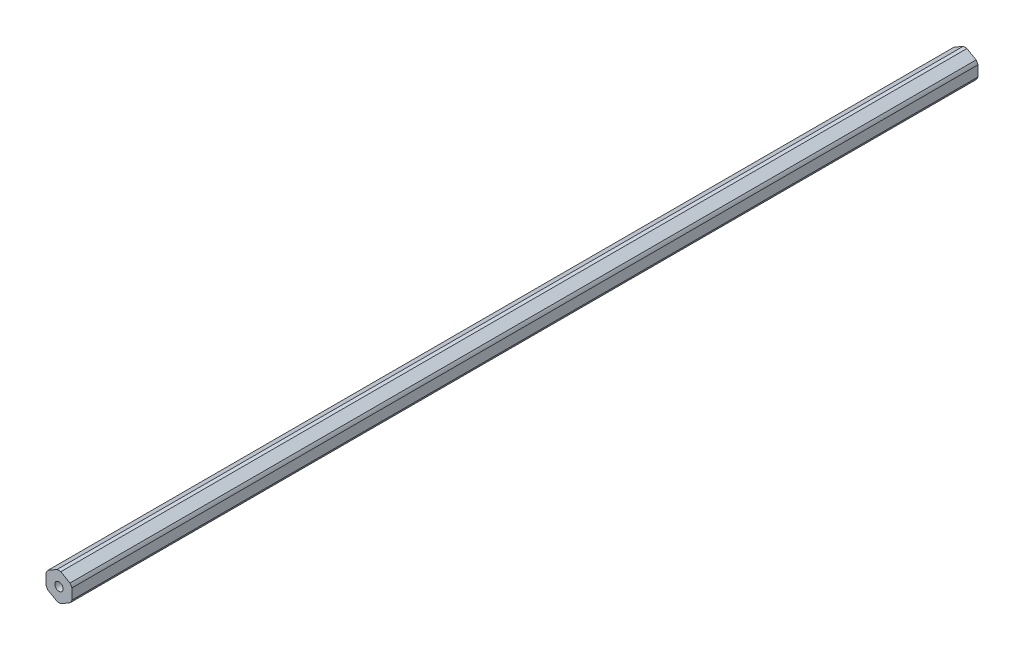
ISO-10303-21;
HEADER;
FILE_DESCRIPTION(('STEP AP214'),'2;1');
FILE_NAME('part.step','',(''),(''),'','','');
FILE_SCHEMA(('AUTOMOTIVE_DESIGN { 1 0 10303 214 1 1 1 1 }'));
ENDSEC;
DATA;
#1=APPLICATION_CONTEXT('core data for automotive mechanical design processes');
#2=APPLICATION_PROTOCOL_DEFINITION('international standard','automotive_design',2000,#1);
#3=PRODUCT_CONTEXT('',#1,'mechanical');
#4=PRODUCT('Part','Part','',(#3));
#5=PRODUCT_RELATED_PRODUCT_CATEGORY('part','',(#4));
#6=PRODUCT_DEFINITION_FORMATION('','',#4);
#7=PRODUCT_DEFINITION_CONTEXT('part definition',#1,'design');
#8=PRODUCT_DEFINITION('design','',#6,#7);
#9=PRODUCT_DEFINITION_SHAPE('','',#8);
#10=(LENGTH_UNIT() NAMED_UNIT(*) SI_UNIT(.MILLI.,.METRE.));
#11=(NAMED_UNIT(*) PLANE_ANGLE_UNIT() SI_UNIT($,.RADIAN.));
#12=(NAMED_UNIT(*) SI_UNIT($,.STERADIAN.) SOLID_ANGLE_UNIT());
#13=UNCERTAINTY_MEASURE_WITH_UNIT(LENGTH_MEASURE(1.E-05),#10,'distance_accuracy_value','');
#14=(GEOMETRIC_REPRESENTATION_CONTEXT(3) GLOBAL_UNCERTAINTY_ASSIGNED_CONTEXT((#13)) GLOBAL_UNIT_ASSIGNED_CONTEXT((#10,
#11,#12)) REPRESENTATION_CONTEXT('',''));
#15=CARTESIAN_POINT('',(0.,0.,0.));
#16=DIRECTION('',(0.,0.,1.));
#17=DIRECTION('',(1.,0.,0.));
#18=AXIS2_PLACEMENT_3D('',#15,#16,#17);
#19=CARTESIAN_POINT('',(6.35,0.,444.5));
#20=DIRECTION('',(-1.,0.,0.));
#21=DIRECTION('',(0.,-1.,0.));
#22=AXIS2_PLACEMENT_3D('',#19,#20,#21);
#23=PLANE('',#22);
#24=DIRECTION('',(0.,1.,0.));
#25=VECTOR('',#24,1.);
#26=CARTESIAN_POINT('',(6.35,0.,0.));
#27=LINE('',#26,#25);
#28=CARTESIAN_POINT('',(6.35,-2.59030191290514,0.));
#29=VERTEX_POINT('',#28);
#30=CARTESIAN_POINT('',(6.35,2.59030191290514,0.));
#31=VERTEX_POINT('',#30);
#32=EDGE_CURVE('E180',#29,#31,#27,.T.);
#33=ORIENTED_EDGE('',*,*,#32,.T.);
#34=DIRECTION('',(0.,0.,-1.));
#35=VECTOR('',#34,1.);
#36=CARTESIAN_POINT('',(6.35,2.59030191290514,444.5));
#37=LINE('',#36,#35);
#38=CARTESIAN_POINT('',(6.35,2.59030191290514,444.5));
#39=VERTEX_POINT('',#38);
#40=EDGE_CURVE('E11',#39,#31,#37,.T.);
#41=ORIENTED_EDGE('',*,*,#40,.F.);
#42=DIRECTION('',(0.,1.,0.));
#43=VECTOR('',#42,1.);
#44=CARTESIAN_POINT('',(6.35,0.,444.5));
#45=LINE('',#44,#43);
#46=CARTESIAN_POINT('',(6.35,-2.59030191290514,444.5));
#47=VERTEX_POINT('',#46);
#48=EDGE_CURVE('E260',#47,#39,#45,.T.);
#49=ORIENTED_EDGE('',*,*,#48,.F.);
#50=DIRECTION('',(0.,0.,-1.));
#51=VECTOR('',#50,1.);
#52=CARTESIAN_POINT('',(6.35,-2.59030191290514,444.5));
#53=LINE('',#52,#51);
#54=EDGE_CURVE('E176',#47,#29,#53,.T.);
#55=ORIENTED_EDGE('',*,*,#54,.T.);
#56=EDGE_LOOP('',(#33,#41,#49,#55));
#57=FACE_BOUND('',#56,.T.);
#58=ADVANCED_FACE('F51',(#57),#23,.F.);
#59=CARTESIAN_POINT('',(0.,0.,444.5));
#60=DIRECTION('',(0.,0.,-1.));
#61=DIRECTION('',(-1.,0.,0.));
#62=AXIS2_PLACEMENT_3D('',#59,#60,#61);
#63=CYLINDRICAL_SURFACE('',#62,6.858);
#64=CARTESIAN_POINT('',(0.,0.,0.));
#65=DIRECTION('',(0.,0.,1.));
#66=DIRECTION('',(1.,0.,0.));
#67=AXIS2_PLACEMENT_3D('',#64,#65,#66);
#68=CIRCLE('',#67,6.858);
#69=CARTESIAN_POINT('',(5.41826726004728,4.20411035757861,0.));
#70=VERTEX_POINT('',#69);
#71=EDGE_CURVE('E184',#31,#70,#68,.T.);
#72=ORIENTED_EDGE('',*,*,#71,.T.);
#73=DIRECTION('',(0.,0.,-1.));
#74=VECTOR('',#73,1.);
#75=CARTESIAN_POINT('',(5.41826726004728,4.20411035757861,444.5));
#76=LINE('',#75,#74);
#77=CARTESIAN_POINT('',(5.41826726004728,4.20411035757861,444.5));
#78=VERTEX_POINT('',#77);
#79=EDGE_CURVE('E60',#78,#70,#76,.T.);
#80=ORIENTED_EDGE('',*,*,#79,.F.);
#81=CARTESIAN_POINT('',(0.,0.,444.5));
#82=DIRECTION('',(0.,0.,1.));
#83=DIRECTION('',(1.,0.,0.));
#84=AXIS2_PLACEMENT_3D('',#81,#82,#83);
#85=CIRCLE('',#84,6.858);
#86=EDGE_CURVE('E124',#39,#78,#85,.T.);
#87=ORIENTED_EDGE('',*,*,#86,.F.);
#88=ORIENTED_EDGE('',*,*,#40,.T.);
#89=EDGE_LOOP('',(#72,#80,#87,#88));
#90=FACE_BOUND('',#89,.T.);
#91=ADVANCED_FACE('F303',(#90),#63,.T.);
#92=CARTESIAN_POINT('',(3.175,5.49926131403118,444.5));
#93=DIRECTION('',(-0.5,-0.866025403784439,0.));
#94=DIRECTION('',(0.866025403784439,-0.5,0.));
#95=AXIS2_PLACEMENT_3D('',#92,#93,#94);
#96=PLANE('',#95);
#97=DIRECTION('',(-0.866025403784439,0.5,0.));
#98=VECTOR('',#97,1.);
#99=CARTESIAN_POINT('',(3.175,5.49926131403118,0.));
#100=LINE('',#99,#98);
#101=CARTESIAN_POINT('',(0.93173273995272,6.79441227048376,0.));
#102=VERTEX_POINT('',#101);
#103=EDGE_CURVE('E188',#70,#102,#100,.T.);
#104=ORIENTED_EDGE('',*,*,#103,.T.);
#105=DIRECTION('',(0.,0.,-1.));
#106=VECTOR('',#105,1.);
#107=CARTESIAN_POINT('',(0.93173273995272,6.79441227048376,444.5));
#108=LINE('',#107,#106);
#109=CARTESIAN_POINT('',(0.93173273995272,6.79441227048376,444.5));
#110=VERTEX_POINT('',#109);
#111=EDGE_CURVE('E231',#110,#102,#108,.T.);
#112=ORIENTED_EDGE('',*,*,#111,.F.);
#113=DIRECTION('',(-0.866025403784439,0.5,0.));
#114=VECTOR('',#113,1.);
#115=CARTESIAN_POINT('',(3.175,5.49926131403118,444.5));
#116=LINE('',#115,#114);
#117=EDGE_CURVE('E241',#78,#110,#116,.T.);
#118=ORIENTED_EDGE('',*,*,#117,.F.);
#119=ORIENTED_EDGE('',*,*,#79,.T.);
#120=EDGE_LOOP('',(#104,#112,#118,#119));
#121=FACE_BOUND('',#120,.T.);
#122=ADVANCED_FACE('F239',(#121),#96,.F.);
#123=CARTESIAN_POINT('',(-0.931732739952724,6.79441227048375,0.));
#124=VERTEX_POINT('',#123);
#125=EDGE_CURVE('E189',#102,#124,#68,.T.);
#126=ORIENTED_EDGE('',*,*,#125,.T.);
#127=DIRECTION('',(0.,0.,-1.));
#128=VECTOR('',#127,1.);
#129=CARTESIAN_POINT('',(-0.931732739952724,6.79441227048375,444.5));
#130=LINE('',#129,#128);
#131=CARTESIAN_POINT('',(-0.931732739952724,6.79441227048375,444.5));
#132=VERTEX_POINT('',#131);
#133=EDGE_CURVE('E227',#132,#124,#130,.T.);
#134=ORIENTED_EDGE('',*,*,#133,.F.);
#135=EDGE_CURVE('E266',#110,#132,#85,.T.);
#136=ORIENTED_EDGE('',*,*,#135,.F.);
#137=ORIENTED_EDGE('',*,*,#111,.T.);
#138=EDGE_LOOP('',(#126,#134,#136,#137));
#139=FACE_BOUND('',#138,.T.);
#140=ADVANCED_FACE('F286',(#139),#63,.T.);
#141=CARTESIAN_POINT('',(-3.175,5.49926131403118,444.5));
#142=DIRECTION('',(0.5,-0.866025403784438,0.));
#143=DIRECTION('',(0.866025403784438,0.500000000000001,0.));
#144=AXIS2_PLACEMENT_3D('',#141,#142,#143);
#145=PLANE('',#144);
#146=DIRECTION('',(-0.866025403784438,-0.500000000000001,0.));
#147=VECTOR('',#146,1.);
#148=CARTESIAN_POINT('',(-3.175,5.49926131403118,0.));
#149=LINE('',#148,#147);
#150=CARTESIAN_POINT('',(-5.41826726004728,4.20411035757861,0.));
#151=VERTEX_POINT('',#150);
#152=EDGE_CURVE('E192',#124,#151,#149,.T.);
#153=ORIENTED_EDGE('',*,*,#152,.T.);
#154=DIRECTION('',(0.,0.,-1.));
#155=VECTOR('',#154,1.);
#156=CARTESIAN_POINT('',(-5.41826726004728,4.20411035757861,444.5));
#157=LINE('',#156,#155);
#158=CARTESIAN_POINT('',(-5.41826726004728,4.20411035757861,444.5));
#159=VERTEX_POINT('',#158);
#160=EDGE_CURVE('E223',#159,#151,#157,.T.);
#161=ORIENTED_EDGE('',*,*,#160,.F.);
#162=DIRECTION('',(-0.866025403784438,-0.500000000000001,0.));
#163=VECTOR('',#162,1.);
#164=CARTESIAN_POINT('',(-3.175,5.49926131403118,444.5));
#165=LINE('',#164,#163);
#166=EDGE_CURVE('E272',#132,#159,#165,.T.);
#167=ORIENTED_EDGE('',*,*,#166,.F.);
#168=ORIENTED_EDGE('',*,*,#133,.T.);
#169=EDGE_LOOP('',(#153,#161,#167,#168));
#170=FACE_BOUND('',#169,.T.);
#171=ADVANCED_FACE('F288',(#170),#145,.F.);
#172=CARTESIAN_POINT('',(-6.35,2.59030191290514,0.));
#173=VERTEX_POINT('',#172);
#174=EDGE_CURVE('E195',#151,#173,#68,.T.);
#175=ORIENTED_EDGE('',*,*,#174,.T.);
#176=DIRECTION('',(0.,0.,-1.));
#177=VECTOR('',#176,1.);
#178=CARTESIAN_POINT('',(-6.35,2.59030191290514,444.5));
#179=LINE('',#178,#177);
#180=CARTESIAN_POINT('',(-6.35,2.59030191290514,444.5));
#181=VERTEX_POINT('',#180);
#182=EDGE_CURVE('E219',#181,#173,#179,.T.);
#183=ORIENTED_EDGE('',*,*,#182,.F.);
#184=EDGE_CURVE('E274',#159,#181,#85,.T.);
#185=ORIENTED_EDGE('',*,*,#184,.F.);
#186=ORIENTED_EDGE('',*,*,#160,.T.);
#187=EDGE_LOOP('',(#175,#183,#185,#186));
#188=FACE_BOUND('',#187,.T.);
#189=ADVANCED_FACE('F289',(#188),#63,.T.);
#190=CARTESIAN_POINT('',(-6.35,0.,444.5));
#191=DIRECTION('',(1.,0.,0.));
#192=DIRECTION('',(0.,1.,0.));
#193=AXIS2_PLACEMENT_3D('',#190,#191,#192);
#194=PLANE('',#193);
#195=DIRECTION('',(0.,-1.,0.));
#196=VECTOR('',#195,1.);
#197=CARTESIAN_POINT('',(-6.35,0.,0.));
#198=LINE('',#197,#196);
#199=CARTESIAN_POINT('',(-6.35,-2.59030191290515,0.));
#200=VERTEX_POINT('',#199);
#201=EDGE_CURVE('E196',#173,#200,#198,.T.);
#202=ORIENTED_EDGE('',*,*,#201,.T.);
#203=DIRECTION('',(0.,0.,-1.));
#204=VECTOR('',#203,1.);
#205=CARTESIAN_POINT('',(-6.35,-2.59030191290515,444.5));
#206=LINE('',#205,#204);
#207=CARTESIAN_POINT('',(-6.35,-2.59030191290515,444.5));
#208=VERTEX_POINT('',#207);
#209=EDGE_CURVE('E215',#208,#200,#206,.T.);
#210=ORIENTED_EDGE('',*,*,#209,.F.);
#211=DIRECTION('',(0.,-1.,0.));
#212=VECTOR('',#211,1.);
#213=CARTESIAN_POINT('',(-6.35,0.,444.5));
#214=LINE('',#213,#212);
#215=EDGE_CURVE('E275',#181,#208,#214,.T.);
#216=ORIENTED_EDGE('',*,*,#215,.F.);
#217=ORIENTED_EDGE('',*,*,#182,.T.);
#218=EDGE_LOOP('',(#202,#210,#216,#217));
#219=FACE_BOUND('',#218,.T.);
#220=ADVANCED_FACE('F292',(#219),#194,.F.);
#221=CARTESIAN_POINT('',(-5.41826726004727,-4.20411035757862,0.));
#222=VERTEX_POINT('',#221);
#223=EDGE_CURVE('E199',#200,#222,#68,.T.);
#224=ORIENTED_EDGE('',*,*,#223,.T.);
#225=DIRECTION('',(0.,0.,-1.));
#226=VECTOR('',#225,1.);
#227=CARTESIAN_POINT('',(-5.41826726004727,-4.20411035757862,444.5));
#228=LINE('',#227,#226);
#229=CARTESIAN_POINT('',(-5.41826726004727,-4.20411035757862,444.5));
#230=VERTEX_POINT('',#229);
#231=EDGE_CURVE('E211',#230,#222,#228,.T.);
#232=ORIENTED_EDGE('',*,*,#231,.F.);
#233=EDGE_CURVE('E163',#208,#230,#85,.T.);
#234=ORIENTED_EDGE('',*,*,#233,.F.);
#235=ORIENTED_EDGE('',*,*,#209,.T.);
#236=EDGE_LOOP('',(#224,#232,#234,#235));
#237=FACE_BOUND('',#236,.T.);
#238=ADVANCED_FACE('F294',(#237),#63,.T.);
#239=CARTESIAN_POINT('',(-3.175,-5.49926131403119,444.5));
#240=DIRECTION('',(0.5,0.866025403784439,0.));
#241=DIRECTION('',(-0.866025403784439,0.5,0.));
#242=AXIS2_PLACEMENT_3D('',#239,#240,#241);
#243=PLANE('',#242);
#244=DIRECTION('',(0.866025403784439,-0.5,0.));
#245=VECTOR('',#244,1.);
#246=CARTESIAN_POINT('',(-3.175,-5.49926131403119,0.));
#247=LINE('',#246,#245);
#248=CARTESIAN_POINT('',(-0.931732739952729,-6.79441227048375,0.));
#249=VERTEX_POINT('',#248);
#250=EDGE_CURVE('E200',#222,#249,#247,.T.);
#251=ORIENTED_EDGE('',*,*,#250,.T.);
#252=DIRECTION('',(0.,0.,-1.));
#253=VECTOR('',#252,1.);
#254=CARTESIAN_POINT('',(-0.931732739952729,-6.79441227048375,444.5));
#255=LINE('',#254,#253);
#256=CARTESIAN_POINT('',(-0.931732739952729,-6.79441227048375,444.5));
#257=VERTEX_POINT('',#256);
#258=EDGE_CURVE('E169',#257,#249,#255,.T.);
#259=ORIENTED_EDGE('',*,*,#258,.F.);
#260=DIRECTION('',(0.866025403784439,-0.5,0.));
#261=VECTOR('',#260,1.);
#262=CARTESIAN_POINT('',(-3.175,-5.49926131403119,444.5));
#263=LINE('',#262,#261);
#264=EDGE_CURVE('E157',#230,#257,#263,.T.);
#265=ORIENTED_EDGE('',*,*,#264,.F.);
#266=ORIENTED_EDGE('',*,*,#231,.T.);
#267=EDGE_LOOP('',(#251,#259,#265,#266));
#268=FACE_BOUND('',#267,.T.);
#269=ADVANCED_FACE('F297',(#268),#243,.F.);
#270=CARTESIAN_POINT('',(0.931732739952726,-6.79441227048375,0.));
#271=VERTEX_POINT('',#270);
#272=EDGE_CURVE('E167',#249,#271,#68,.T.);
#273=ORIENTED_EDGE('',*,*,#272,.T.);
#274=DIRECTION('',(0.,0.,-1.));
#275=VECTOR('',#274,1.);
#276=CARTESIAN_POINT('',(0.931732739952726,-6.79441227048375,444.5));
#277=LINE('',#276,#275);
#278=CARTESIAN_POINT('',(0.931732739952726,-6.79441227048375,444.5));
#279=VERTEX_POINT('',#278);
#280=EDGE_CURVE('E164',#279,#271,#277,.T.);
#281=ORIENTED_EDGE('',*,*,#280,.F.);
#282=EDGE_CURVE('E151',#257,#279,#85,.T.);
#283=ORIENTED_EDGE('',*,*,#282,.F.);
#284=ORIENTED_EDGE('',*,*,#258,.T.);
#285=EDGE_LOOP('',(#273,#281,#283,#284));
#286=FACE_BOUND('',#285,.T.);
#287=ADVANCED_FACE('F165',(#286),#63,.T.);
#288=CARTESIAN_POINT('',(3.175,-5.49926131403118,444.5));
#289=DIRECTION('',(-0.5,0.866025403784439,0.));
#290=DIRECTION('',(-0.866025403784439,-0.5,0.));
#291=AXIS2_PLACEMENT_3D('',#288,#289,#290);
#292=PLANE('',#291);
#293=DIRECTION('',(0.866025403784439,0.5,0.));
#294=VECTOR('',#293,1.);
#295=CARTESIAN_POINT('',(3.175,-5.49926131403118,0.));
#296=LINE('',#295,#294);
#297=CARTESIAN_POINT('',(5.41826726004728,-4.20411035757862,0.));
#298=VERTEX_POINT('',#297);
#299=EDGE_CURVE('E110',#271,#298,#296,.T.);
#300=ORIENTED_EDGE('',*,*,#299,.T.);
#301=DIRECTION('',(0.,0.,-1.));
#302=VECTOR('',#301,1.);
#303=CARTESIAN_POINT('',(5.41826726004728,-4.20411035757862,444.5));
#304=LINE('',#303,#302);
#305=CARTESIAN_POINT('',(5.41826726004728,-4.20411035757862,444.5));
#306=VERTEX_POINT('',#305);
#307=EDGE_CURVE('E170',#306,#298,#304,.T.);
#308=ORIENTED_EDGE('',*,*,#307,.F.);
#309=DIRECTION('',(0.866025403784439,0.5,0.));
#310=VECTOR('',#309,1.);
#311=CARTESIAN_POINT('',(3.175,-5.49926131403118,444.5));
#312=LINE('',#311,#310);
#313=EDGE_CURVE('E155',#279,#306,#312,.T.);
#314=ORIENTED_EDGE('',*,*,#313,.F.);
#315=ORIENTED_EDGE('',*,*,#280,.T.);
#316=EDGE_LOOP('',(#300,#308,#314,#315));
#317=FACE_BOUND('',#316,.T.);
#318=ADVANCED_FACE('F172',(#317),#292,.F.);
#319=EDGE_CURVE('E116',#298,#29,#68,.T.);
#320=ORIENTED_EDGE('',*,*,#319,.T.);
#321=ORIENTED_EDGE('',*,*,#54,.F.);
#322=EDGE_CURVE('E68',#306,#47,#85,.T.);
#323=ORIENTED_EDGE('',*,*,#322,.F.);
#324=ORIENTED_EDGE('',*,*,#307,.T.);
#325=EDGE_LOOP('',(#320,#321,#323,#324));
#326=FACE_BOUND('',#325,.T.);
#327=ADVANCED_FACE('F300',(#326),#63,.T.);
#328=CARTESIAN_POINT('',(0.,0.,444.5));
#329=DIRECTION('',(0.,0.,1.));
#330=DIRECTION('',(1.,0.,0.));
#331=AXIS2_PLACEMENT_3D('',#328,#329,#330);
#332=PLANE('',#331);
#333=CARTESIAN_POINT('',(0.,0.,444.5));
#334=DIRECTION('',(0.,0.,1.));
#335=DIRECTION('',(1.,0.,0.));
#336=AXIS2_PLACEMENT_3D('',#333,#334,#335);
#337=CIRCLE('',#336,2.01929999999999);
#338=CARTESIAN_POINT('',(2.01929999999999,0.,444.5));
#339=VERTEX_POINT('',#338);
#340=EDGE_CURVE('E521',#339,#339,#337,.T.);
#341=ORIENTED_EDGE('',*,*,#340,.F.);
#342=EDGE_LOOP('',(#341));
#343=FACE_BOUND('',#342,.T.);
#344=ORIENTED_EDGE('',*,*,#48,.T.);
#345=ORIENTED_EDGE('',*,*,#86,.T.);
#346=ORIENTED_EDGE('',*,*,#117,.T.);
#347=ORIENTED_EDGE('',*,*,#135,.T.);
#348=ORIENTED_EDGE('',*,*,#166,.T.);
#349=ORIENTED_EDGE('',*,*,#184,.T.);
#350=ORIENTED_EDGE('',*,*,#215,.T.);
#351=ORIENTED_EDGE('',*,*,#233,.T.);
#352=ORIENTED_EDGE('',*,*,#264,.T.);
#353=ORIENTED_EDGE('',*,*,#282,.T.);
#354=ORIENTED_EDGE('',*,*,#313,.T.);
#355=ORIENTED_EDGE('',*,*,#322,.T.);
#356=EDGE_LOOP('',(#344,#345,#346,#347,#348,#349,#350,#351,#352,#353,#354,#355));
#357=FACE_BOUND('',#356,.T.);
#358=ADVANCED_FACE('F153',(#343,#357),#332,.T.);
#359=CARTESIAN_POINT('',(0.,0.,0.));
#360=DIRECTION('',(0.,0.,1.));
#361=DIRECTION('',(1.,0.,0.));
#362=AXIS2_PLACEMENT_3D('',#359,#360,#361);
#363=PLANE('',#362);
#364=CARTESIAN_POINT('',(0.,0.,0.));
#365=DIRECTION('',(0.,0.,-1.));
#366=DIRECTION('',(-1.,0.,0.));
#367=AXIS2_PLACEMENT_3D('',#364,#365,#366);
#368=CIRCLE('',#367,2.01929999999999);
#369=CARTESIAN_POINT('',(-2.01929999999999,0.,0.));
#370=VERTEX_POINT('',#369);
#371=EDGE_CURVE('E525',#370,#370,#368,.T.);
#372=ORIENTED_EDGE('',*,*,#371,.F.);
#373=EDGE_LOOP('',(#372));
#374=FACE_BOUND('',#373,.T.);
#375=ORIENTED_EDGE('',*,*,#32,.F.);
#376=ORIENTED_EDGE('',*,*,#319,.F.);
#377=ORIENTED_EDGE('',*,*,#299,.F.);
#378=ORIENTED_EDGE('',*,*,#272,.F.);
#379=ORIENTED_EDGE('',*,*,#250,.F.);
#380=ORIENTED_EDGE('',*,*,#223,.F.);
#381=ORIENTED_EDGE('',*,*,#201,.F.);
#382=ORIENTED_EDGE('',*,*,#174,.F.);
#383=ORIENTED_EDGE('',*,*,#152,.F.);
#384=ORIENTED_EDGE('',*,*,#125,.F.);
#385=ORIENTED_EDGE('',*,*,#103,.F.);
#386=ORIENTED_EDGE('',*,*,#71,.F.);
#387=EDGE_LOOP('',(#375,#376,#377,#378,#379,#380,#381,#382,#383,#384,#385,#386));
#388=FACE_BOUND('',#387,.T.);
#389=ADVANCED_FACE('F245',(#374,#388),#363,.F.);
#390=CARTESIAN_POINT('',(0.,0.,15.07744));
#391=DIRECTION('',(0.,0.,-1.));
#392=DIRECTION('',(-1.,0.,0.));
#393=AXIS2_PLACEMENT_3D('',#390,#391,#392);
#394=CONICAL_SURFACE('',#393,2.01929999999999,1.02974425867665);
#395=CARTESIAN_POINT('',(0.,0.,16.2907578480024));
#396=VERTEX_POINT('',#395);
#397=VERTEX_LOOP('',#396);
#398=FACE_BOUND('',#397,.T.);
#399=CARTESIAN_POINT('',(0.,0.,15.07744));
#400=DIRECTION('',(0.,0.,-1.));
#401=DIRECTION('',(-1.,0.,0.));
#402=AXIS2_PLACEMENT_3D('',#399,#400,#401);
#403=CIRCLE('',#402,2.01929999999999);
#404=CARTESIAN_POINT('',(-2.01929999999999,0.,15.07744));
#405=VERTEX_POINT('',#404);
#406=EDGE_CURVE('E185',#405,#405,#403,.T.);
#407=ORIENTED_EDGE('',*,*,#406,.T.);
#408=EDGE_LOOP('',(#407));
#409=FACE_BOUND('',#408,.T.);
#410=ADVANCED_FACE('F392',(#398,#409),#394,.F.);
#411=CARTESIAN_POINT('',(0.,0.,0.));
#412=DIRECTION('',(0.,0.,-1.));
#413=DIRECTION('',(-1.,0.,0.));
#414=AXIS2_PLACEMENT_3D('',#411,#412,#413);
#415=CYLINDRICAL_SURFACE('',#414,2.01929999999999);
#416=ORIENTED_EDGE('',*,*,#406,.F.);
#417=EDGE_LOOP('',(#416));
#418=FACE_BOUND('',#417,.T.);
#419=ORIENTED_EDGE('',*,*,#371,.T.);
#420=EDGE_LOOP('',(#419));
#421=FACE_BOUND('',#420,.T.);
#422=ADVANCED_FACE('F404',(#418,#421),#415,.F.);
#423=CARTESIAN_POINT('',(0.,0.,429.42256));
#424=DIRECTION('',(0.,0.,1.));
#425=DIRECTION('',(1.,0.,0.));
#426=AXIS2_PLACEMENT_3D('',#423,#424,#425);
#427=CONICAL_SURFACE('',#426,2.01929999999999,1.02974425867664);
#428=CARTESIAN_POINT('',(0.,0.,428.209242151998));
#429=VERTEX_POINT('',#428);
#430=VERTEX_LOOP('',#429);
#431=FACE_BOUND('',#430,.T.);
#432=CARTESIAN_POINT('',(0.,0.,429.42256));
#433=DIRECTION('',(0.,0.,1.));
#434=DIRECTION('',(1.,0.,0.));
#435=AXIS2_PLACEMENT_3D('',#432,#433,#434);
#436=CIRCLE('',#435,2.01929999999999);
#437=CARTESIAN_POINT('',(2.01929999999999,0.,429.42256));
#438=VERTEX_POINT('',#437);
#439=EDGE_CURVE('E518',#438,#438,#436,.T.);
#440=ORIENTED_EDGE('',*,*,#439,.T.);
#441=EDGE_LOOP('',(#440));
#442=FACE_BOUND('',#441,.T.);
#443=ADVANCED_FACE('F416',(#431,#442),#427,.F.);
#444=CARTESIAN_POINT('',(0.,0.,444.5));
#445=DIRECTION('',(0.,0.,1.));
#446=DIRECTION('',(1.,0.,0.));
#447=AXIS2_PLACEMENT_3D('',#444,#445,#446);
#448=CYLINDRICAL_SURFACE('',#447,2.01929999999999);
#449=ORIENTED_EDGE('',*,*,#439,.F.);
#450=EDGE_LOOP('',(#449));
#451=FACE_BOUND('',#450,.T.);
#452=ORIENTED_EDGE('',*,*,#340,.T.);
#453=EDGE_LOOP('',(#452));
#454=FACE_BOUND('',#453,.T.);
#455=ADVANCED_FACE('F429',(#451,#454),#448,.F.);
#456=CLOSED_SHELL('',(#58,#91,#122,#140,#171,#189,#220,#238,#269,#287,#318,#327,#358,#389,#410,
#422,#443,#455));
#457=MANIFOLD_SOLID_BREP('B2',#456);
#458=ADVANCED_BREP_SHAPE_REPRESENTATION('',(#18,#457),#14);
#459=SHAPE_DEFINITION_REPRESENTATION(#9,#458);
ENDSEC;
END-ISO-10303-21;
